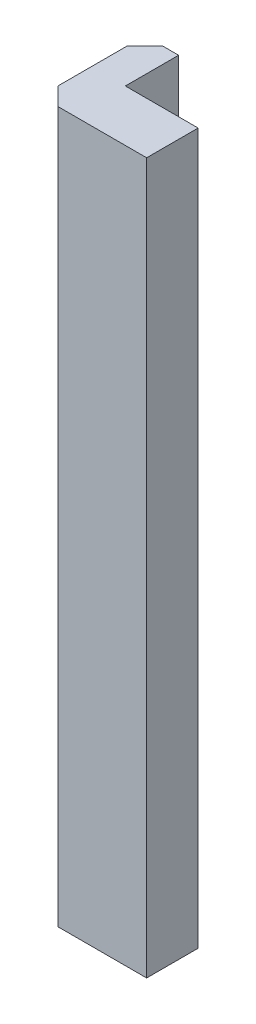
ISO-10303-21;
HEADER;
FILE_DESCRIPTION(('STEP AP214'),'2;1');
FILE_NAME('part.step','',(''),(''),'','','');
FILE_SCHEMA(('AUTOMOTIVE_DESIGN { 1 0 10303 214 1 1 1 1 }'));
ENDSEC;
DATA;
#1=APPLICATION_CONTEXT('core data for automotive mechanical design processes');
#2=APPLICATION_PROTOCOL_DEFINITION('international standard','automotive_design',2000,#1);
#3=PRODUCT_CONTEXT('',#1,'mechanical');
#4=PRODUCT('Part','Part','',(#3));
#5=PRODUCT_RELATED_PRODUCT_CATEGORY('part','',(#4));
#6=PRODUCT_DEFINITION_FORMATION('','',#4);
#7=PRODUCT_DEFINITION_CONTEXT('part definition',#1,'design');
#8=PRODUCT_DEFINITION('design','',#6,#7);
#9=PRODUCT_DEFINITION_SHAPE('','',#8);
#10=(LENGTH_UNIT() NAMED_UNIT(*) SI_UNIT(.MILLI.,.METRE.));
#11=(NAMED_UNIT(*) PLANE_ANGLE_UNIT() SI_UNIT($,.RADIAN.));
#12=(NAMED_UNIT(*) SI_UNIT($,.STERADIAN.) SOLID_ANGLE_UNIT());
#13=UNCERTAINTY_MEASURE_WITH_UNIT(LENGTH_MEASURE(1.E-05),#10,'distance_accuracy_value','');
#14=(GEOMETRIC_REPRESENTATION_CONTEXT(3) GLOBAL_UNCERTAINTY_ASSIGNED_CONTEXT((#13)) GLOBAL_UNIT_ASSIGNED_CONTEXT((#10,
#11,#12)) REPRESENTATION_CONTEXT('',''));
#15=CARTESIAN_POINT('',(0.,0.,0.));
#16=DIRECTION('',(0.,0.,1.));
#17=DIRECTION('',(1.,0.,0.));
#18=AXIS2_PLACEMENT_3D('',#15,#16,#17);
#19=CARTESIAN_POINT('',(0.,40.,2.));
#20=DIRECTION('',(0.707106781186547,0.,-0.707106781186548));
#21=DIRECTION('',(-0.707106781186548,0.,-0.707106781186547));
#22=AXIS2_PLACEMENT_3D('',#19,#20,#21);
#23=PLANE('',#22);
#24=DIRECTION('',(0.707106781186548,0.,0.707106781186547));
#25=VECTOR('',#24,1.);
#26=CARTESIAN_POINT('',(0.,0.,2.));
#27=LINE('',#26,#25);
#28=CARTESIAN_POINT('',(0.,0.,2.));
#29=VERTEX_POINT('',#28);
#30=CARTESIAN_POINT('',(1.,0.,3.));
#31=VERTEX_POINT('',#30);
#32=EDGE_CURVE('E132',#29,#31,#27,.T.);
#33=ORIENTED_EDGE('',*,*,#32,.T.);
#34=DIRECTION('',(0.,-1.,0.));
#35=VECTOR('',#34,1.);
#36=CARTESIAN_POINT('',(1.,40.,3.));
#37=LINE('',#36,#35);
#38=CARTESIAN_POINT('',(1.,40.,3.));
#39=VERTEX_POINT('',#38);
#40=EDGE_CURVE('E40',#39,#31,#37,.T.);
#41=ORIENTED_EDGE('',*,*,#40,.F.);
#42=DIRECTION('',(0.707106781186548,0.,0.707106781186547));
#43=VECTOR('',#42,1.);
#44=CARTESIAN_POINT('',(0.,40.,2.));
#45=LINE('',#44,#43);
#46=CARTESIAN_POINT('',(0.,40.,2.));
#47=VERTEX_POINT('',#46);
#48=EDGE_CURVE('E92',#47,#39,#45,.T.);
#49=ORIENTED_EDGE('',*,*,#48,.F.);
#50=DIRECTION('',(0.,-1.,0.));
#51=VECTOR('',#50,1.);
#52=CARTESIAN_POINT('',(0.,40.,2.));
#53=LINE('',#52,#51);
#54=EDGE_CURVE('E11',#47,#29,#53,.T.);
#55=ORIENTED_EDGE('',*,*,#54,.T.);
#56=EDGE_LOOP('',(#33,#41,#49,#55));
#57=FACE_BOUND('',#56,.T.);
#58=ADVANCED_FACE('F32',(#57),#23,.F.);
#59=CARTESIAN_POINT('',(1.,40.,3.));
#60=DIRECTION('',(0.,0.,-1.));
#61=DIRECTION('',(-1.,0.,0.));
#62=AXIS2_PLACEMENT_3D('',#59,#60,#61);
#63=PLANE('',#62);
#64=DIRECTION('',(1.,0.,0.));
#65=VECTOR('',#64,1.);
#66=CARTESIAN_POINT('',(1.,0.,3.));
#67=LINE('',#66,#65);
#68=CARTESIAN_POINT('',(6.,0.,3.));
#69=VERTEX_POINT('',#68);
#70=EDGE_CURVE('E134',#31,#69,#67,.T.);
#71=ORIENTED_EDGE('',*,*,#70,.T.);
#72=DIRECTION('',(0.,-1.,0.));
#73=VECTOR('',#72,1.);
#74=CARTESIAN_POINT('',(6.,40.,3.));
#75=LINE('',#74,#73);
#76=CARTESIAN_POINT('',(6.,40.,3.));
#77=VERTEX_POINT('',#76);
#78=EDGE_CURVE('E151',#77,#69,#75,.T.);
#79=ORIENTED_EDGE('',*,*,#78,.F.);
#80=DIRECTION('',(1.,0.,0.));
#81=VECTOR('',#80,1.);
#82=CARTESIAN_POINT('',(1.,40.,3.));
#83=LINE('',#82,#81);
#84=EDGE_CURVE('E159',#39,#77,#83,.T.);
#85=ORIENTED_EDGE('',*,*,#84,.F.);
#86=ORIENTED_EDGE('',*,*,#40,.T.);
#87=EDGE_LOOP('',(#71,#79,#85,#86));
#88=FACE_BOUND('',#87,.T.);
#89=ADVANCED_FACE('F157',(#88),#63,.F.);
#90=CARTESIAN_POINT('',(6.,40.,0.0999999999999994));
#91=DIRECTION('',(-1.,0.,0.));
#92=DIRECTION('',(0.,0.,1.));
#93=AXIS2_PLACEMENT_3D('',#90,#91,#92);
#94=PLANE('',#93);
#95=DIRECTION('',(0.,0.,-1.));
#96=VECTOR('',#95,1.);
#97=CARTESIAN_POINT('',(6.,0.,0.0999999999999994));
#98=LINE('',#97,#96);
#99=CARTESIAN_POINT('',(6.,0.,0.0999999999999994));
#100=VERTEX_POINT('',#99);
#101=EDGE_CURVE('E136',#69,#100,#98,.T.);
#102=ORIENTED_EDGE('',*,*,#101,.T.);
#103=DIRECTION('',(0.,-1.,0.));
#104=VECTOR('',#103,1.);
#105=CARTESIAN_POINT('',(6.,40.,0.0999999999999994));
#106=LINE('',#105,#104);
#107=CARTESIAN_POINT('',(6.,40.,0.0999999999999994));
#108=VERTEX_POINT('',#107);
#109=EDGE_CURVE('E148',#108,#100,#106,.T.);
#110=ORIENTED_EDGE('',*,*,#109,.F.);
#111=DIRECTION('',(0.,0.,-1.));
#112=VECTOR('',#111,1.);
#113=CARTESIAN_POINT('',(6.,40.,0.0999999999999994));
#114=LINE('',#113,#112);
#115=EDGE_CURVE('E172',#77,#108,#114,.T.);
#116=ORIENTED_EDGE('',*,*,#115,.F.);
#117=ORIENTED_EDGE('',*,*,#78,.T.);
#118=EDGE_LOOP('',(#102,#110,#116,#117));
#119=FACE_BOUND('',#118,.T.);
#120=ADVANCED_FACE('F168',(#119),#94,.F.);
#121=CARTESIAN_POINT('',(1.9,40.,0.0999999999999997));
#122=DIRECTION('',(0.,0.,1.));
#123=DIRECTION('',(1.,0.,0.));
#124=AXIS2_PLACEMENT_3D('',#121,#122,#123);
#125=PLANE('',#124);
#126=DIRECTION('',(-1.,0.,0.));
#127=VECTOR('',#126,1.);
#128=CARTESIAN_POINT('',(1.9,0.,0.0999999999999997));
#129=LINE('',#128,#127);
#130=CARTESIAN_POINT('',(1.9,0.,0.0999999999999997));
#131=VERTEX_POINT('',#130);
#132=EDGE_CURVE('E138',#100,#131,#129,.T.);
#133=ORIENTED_EDGE('',*,*,#132,.T.);
#134=DIRECTION('',(0.,-1.,0.));
#135=VECTOR('',#134,1.);
#136=CARTESIAN_POINT('',(1.9,40.,0.0999999999999997));
#137=LINE('',#136,#135);
#138=CARTESIAN_POINT('',(1.9,40.,0.0999999999999997));
#139=VERTEX_POINT('',#138);
#140=EDGE_CURVE('E121',#139,#131,#137,.T.);
#141=ORIENTED_EDGE('',*,*,#140,.F.);
#142=DIRECTION('',(-1.,0.,0.));
#143=VECTOR('',#142,1.);
#144=CARTESIAN_POINT('',(1.9,40.,0.0999999999999997));
#145=LINE('',#144,#143);
#146=EDGE_CURVE('E112',#108,#139,#145,.T.);
#147=ORIENTED_EDGE('',*,*,#146,.F.);
#148=ORIENTED_EDGE('',*,*,#109,.T.);
#149=EDGE_LOOP('',(#133,#141,#147,#148));
#150=FACE_BOUND('',#149,.T.);
#151=ADVANCED_FACE('F171',(#150),#125,.F.);
#152=CARTESIAN_POINT('',(1.9,40.,0.0999999999999997));
#153=DIRECTION('',(-1.,0.,0.));
#154=DIRECTION('',(0.,0.,1.));
#155=AXIS2_PLACEMENT_3D('',#152,#153,#154);
#156=PLANE('',#155);
#157=DIRECTION('',(0.,0.,-1.));
#158=VECTOR('',#157,1.);
#159=CARTESIAN_POINT('',(1.9,0.,0.0999999999999997));
#160=LINE('',#159,#158);
#161=CARTESIAN_POINT('',(1.9,0.,-2.9));
#162=VERTEX_POINT('',#161);
#163=EDGE_CURVE('E120',#131,#162,#160,.T.);
#164=ORIENTED_EDGE('',*,*,#163,.T.);
#165=DIRECTION('',(0.,-1.,0.));
#166=VECTOR('',#165,1.);
#167=CARTESIAN_POINT('',(1.9,40.,-2.9));
#168=LINE('',#167,#166);
#169=CARTESIAN_POINT('',(1.9,40.,-2.9));
#170=VERTEX_POINT('',#169);
#171=EDGE_CURVE('E117',#170,#162,#168,.T.);
#172=ORIENTED_EDGE('',*,*,#171,.F.);
#173=DIRECTION('',(0.,0.,-1.));
#174=VECTOR('',#173,1.);
#175=CARTESIAN_POINT('',(1.9,40.,0.0999999999999997));
#176=LINE('',#175,#174);
#177=EDGE_CURVE('E106',#139,#170,#176,.T.);
#178=ORIENTED_EDGE('',*,*,#177,.F.);
#179=ORIENTED_EDGE('',*,*,#140,.T.);
#180=EDGE_LOOP('',(#164,#172,#178,#179));
#181=FACE_BOUND('',#180,.T.);
#182=ADVANCED_FACE('F118',(#181),#156,.F.);
#183=CARTESIAN_POINT('',(1.,40.,-2.9));
#184=DIRECTION('',(0.,0.,1.));
#185=DIRECTION('',(1.,0.,0.));
#186=AXIS2_PLACEMENT_3D('',#183,#184,#185);
#187=PLANE('',#186);
#188=DIRECTION('',(-1.,0.,0.));
#189=VECTOR('',#188,1.);
#190=CARTESIAN_POINT('',(1.,0.,-2.9));
#191=LINE('',#190,#189);
#192=CARTESIAN_POINT('',(1.,0.,-2.9));
#193=VERTEX_POINT('',#192);
#194=EDGE_CURVE('E78',#162,#193,#191,.T.);
#195=ORIENTED_EDGE('',*,*,#194,.T.);
#196=DIRECTION('',(0.,-1.,0.));
#197=VECTOR('',#196,1.);
#198=CARTESIAN_POINT('',(1.,40.,-2.9));
#199=LINE('',#198,#197);
#200=CARTESIAN_POINT('',(1.,40.,-2.9));
#201=VERTEX_POINT('',#200);
#202=EDGE_CURVE('E122',#201,#193,#199,.T.);
#203=ORIENTED_EDGE('',*,*,#202,.F.);
#204=DIRECTION('',(-1.,0.,0.));
#205=VECTOR('',#204,1.);
#206=CARTESIAN_POINT('',(1.,40.,-2.9));
#207=LINE('',#206,#205);
#208=EDGE_CURVE('E110',#170,#201,#207,.T.);
#209=ORIENTED_EDGE('',*,*,#208,.F.);
#210=ORIENTED_EDGE('',*,*,#171,.T.);
#211=EDGE_LOOP('',(#195,#203,#209,#210));
#212=FACE_BOUND('',#211,.T.);
#213=ADVANCED_FACE('F124',(#212),#187,.F.);
#214=CARTESIAN_POINT('',(0.,40.,-1.9));
#215=DIRECTION('',(0.707106781186548,0.,0.707106781186548));
#216=DIRECTION('',(0.707106781186548,0.,-0.707106781186548));
#217=AXIS2_PLACEMENT_3D('',#214,#215,#216);
#218=PLANE('',#217);
#219=DIRECTION('',(-0.707106781186548,0.,0.707106781186548));
#220=VECTOR('',#219,1.);
#221=CARTESIAN_POINT('',(0.,0.,-1.9));
#222=LINE('',#221,#220);
#223=CARTESIAN_POINT('',(0.,0.,-1.9));
#224=VERTEX_POINT('',#223);
#225=EDGE_CURVE('E85',#193,#224,#222,.T.);
#226=ORIENTED_EDGE('',*,*,#225,.T.);
#227=DIRECTION('',(0.,-1.,0.));
#228=VECTOR('',#227,1.);
#229=CARTESIAN_POINT('',(0.,40.,-1.9));
#230=LINE('',#229,#228);
#231=CARTESIAN_POINT('',(0.,40.,-1.9));
#232=VERTEX_POINT('',#231);
#233=EDGE_CURVE('E128',#232,#224,#230,.T.);
#234=ORIENTED_EDGE('',*,*,#233,.F.);
#235=DIRECTION('',(-0.707106781186548,0.,0.707106781186548));
#236=VECTOR('',#235,1.);
#237=CARTESIAN_POINT('',(0.,40.,-1.9));
#238=LINE('',#237,#236);
#239=EDGE_CURVE('E126',#201,#232,#238,.T.);
#240=ORIENTED_EDGE('',*,*,#239,.F.);
#241=ORIENTED_EDGE('',*,*,#202,.T.);
#242=EDGE_LOOP('',(#226,#234,#240,#241));
#243=FACE_BOUND('',#242,.T.);
#244=ADVANCED_FACE('F193',(#243),#218,.F.);
#245=CARTESIAN_POINT('',(0.,40.,0.));
#246=DIRECTION('',(1.,0.,0.));
#247=DIRECTION('',(0.,0.,-1.));
#248=AXIS2_PLACEMENT_3D('',#245,#246,#247);
#249=PLANE('',#248);
#250=DIRECTION('',(0.,0.,1.));
#251=VECTOR('',#250,1.);
#252=CARTESIAN_POINT('',(0.,0.,0.));
#253=LINE('',#252,#251);
#254=EDGE_CURVE('E143',#224,#29,#253,.T.);
#255=ORIENTED_EDGE('',*,*,#254,.T.);
#256=ORIENTED_EDGE('',*,*,#54,.F.);
#257=DIRECTION('',(0.,0.,1.));
#258=VECTOR('',#257,1.);
#259=CARTESIAN_POINT('',(0.,40.,0.));
#260=LINE('',#259,#258);
#261=EDGE_CURVE('E48',#232,#47,#260,.T.);
#262=ORIENTED_EDGE('',*,*,#261,.F.);
#263=ORIENTED_EDGE('',*,*,#233,.T.);
#264=EDGE_LOOP('',(#255,#256,#262,#263));
#265=FACE_BOUND('',#264,.T.);
#266=ADVANCED_FACE('F177',(#265),#249,.F.);
#267=CARTESIAN_POINT('',(0.,40.,0.));
#268=DIRECTION('',(0.,1.,0.));
#269=DIRECTION('',(0.,0.,1.));
#270=AXIS2_PLACEMENT_3D('',#267,#268,#269);
#271=PLANE('',#270);
#272=ORIENTED_EDGE('',*,*,#261,.T.);
#273=ORIENTED_EDGE('',*,*,#48,.T.);
#274=ORIENTED_EDGE('',*,*,#84,.T.);
#275=ORIENTED_EDGE('',*,*,#115,.T.);
#276=ORIENTED_EDGE('',*,*,#146,.T.);
#277=ORIENTED_EDGE('',*,*,#177,.T.);
#278=ORIENTED_EDGE('',*,*,#208,.T.);
#279=ORIENTED_EDGE('',*,*,#239,.T.);
#280=EDGE_LOOP('',(#272,#273,#274,#275,#276,#277,#278,#279));
#281=FACE_BOUND('',#280,.T.);
#282=ADVANCED_FACE('F108',(#281),#271,.T.);
#283=CARTESIAN_POINT('',(0.,0.,0.));
#284=DIRECTION('',(0.,1.,0.));
#285=DIRECTION('',(0.,0.,1.));
#286=AXIS2_PLACEMENT_3D('',#283,#284,#285);
#287=PLANE('',#286);
#288=ORIENTED_EDGE('',*,*,#32,.F.);
#289=ORIENTED_EDGE('',*,*,#254,.F.);
#290=ORIENTED_EDGE('',*,*,#225,.F.);
#291=ORIENTED_EDGE('',*,*,#194,.F.);
#292=ORIENTED_EDGE('',*,*,#163,.F.);
#293=ORIENTED_EDGE('',*,*,#132,.F.);
#294=ORIENTED_EDGE('',*,*,#101,.F.);
#295=ORIENTED_EDGE('',*,*,#70,.F.);
#296=EDGE_LOOP('',(#288,#289,#290,#291,#292,#293,#294,#295));
#297=FACE_BOUND('',#296,.T.);
#298=ADVANCED_FACE('F163',(#297),#287,.F.);
#299=CLOSED_SHELL('',(#58,#89,#120,#151,#182,#213,#244,#266,#282,#298));
#300=MANIFOLD_SOLID_BREP('B2',#299);
#301=ADVANCED_BREP_SHAPE_REPRESENTATION('',(#18,#300),#14);
#302=SHAPE_DEFINITION_REPRESENTATION(#9,#301);
ENDSEC;
END-ISO-10303-21;
